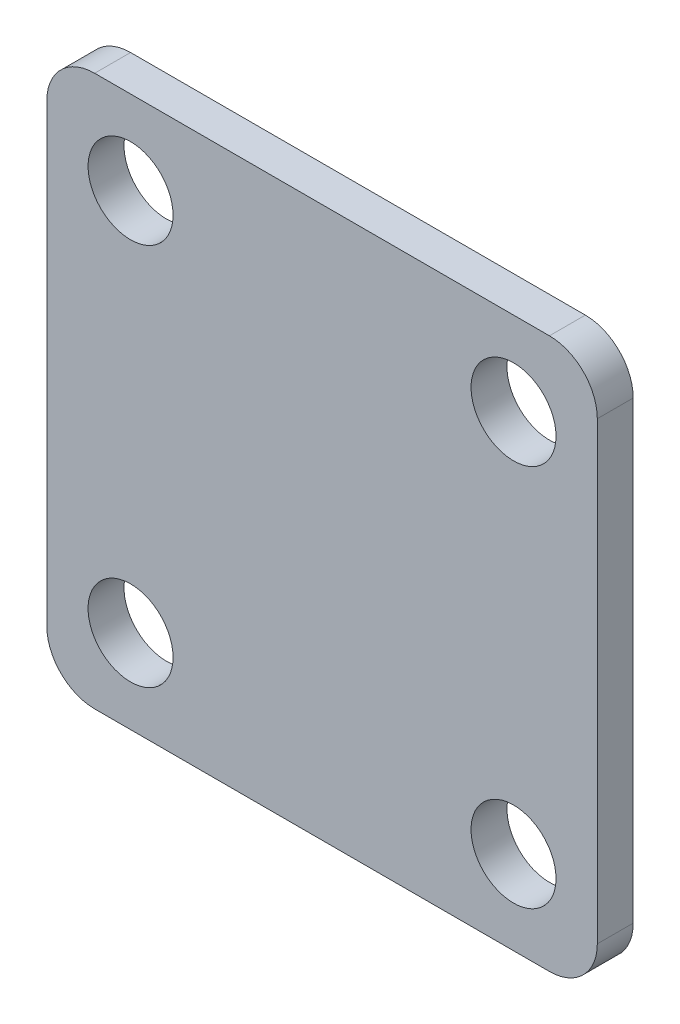
ISO-10303-21;
HEADER;
FILE_DESCRIPTION(('STEP AP214'),'2;1');
FILE_NAME('part.step','',(''),(''),'','','');
FILE_SCHEMA(('AUTOMOTIVE_DESIGN { 1 0 10303 214 1 1 1 1 }'));
ENDSEC;
DATA;
#1=APPLICATION_CONTEXT('core data for automotive mechanical design processes');
#2=APPLICATION_PROTOCOL_DEFINITION('international standard','automotive_design',2000,#1);
#3=PRODUCT_CONTEXT('',#1,'mechanical');
#4=PRODUCT('Part','Part','',(#3));
#5=PRODUCT_RELATED_PRODUCT_CATEGORY('part','',(#4));
#6=PRODUCT_DEFINITION_FORMATION('','',#4);
#7=PRODUCT_DEFINITION_CONTEXT('part definition',#1,'design');
#8=PRODUCT_DEFINITION('design','',#6,#7);
#9=PRODUCT_DEFINITION_SHAPE('','',#8);
#10=(LENGTH_UNIT() NAMED_UNIT(*) SI_UNIT(.MILLI.,.METRE.));
#11=(NAMED_UNIT(*) PLANE_ANGLE_UNIT() SI_UNIT($,.RADIAN.));
#12=(NAMED_UNIT(*) SI_UNIT($,.STERADIAN.) SOLID_ANGLE_UNIT());
#13=UNCERTAINTY_MEASURE_WITH_UNIT(LENGTH_MEASURE(1.E-05),#10,'distance_accuracy_value','');
#14=(GEOMETRIC_REPRESENTATION_CONTEXT(3) GLOBAL_UNCERTAINTY_ASSIGNED_CONTEXT((#13)) GLOBAL_UNIT_ASSIGNED_CONTEXT((#10,
#11,#12)) REPRESENTATION_CONTEXT('',''));
#15=CARTESIAN_POINT('',(0.,0.,0.));
#16=DIRECTION('',(0.,0.,1.));
#17=DIRECTION('',(1.,0.,0.));
#18=AXIS2_PLACEMENT_3D('',#15,#16,#17);
#19=CARTESIAN_POINT('',(-9.5,-9.5,1.5));
#20=DIRECTION('',(0.,0.,1.));
#21=DIRECTION('',(1.,0.,0.));
#22=AXIS2_PLACEMENT_3D('',#19,#20,#21);
#23=PLANE('',#22);
#24=CARTESIAN_POINT('',(8.00000040045571,-8.00000040045571,1.5));
#25=DIRECTION('',(0.,0.,1.));
#26=DIRECTION('',(1.,0.,0.));
#27=AXIS2_PLACEMENT_3D('',#24,#25,#26);
#28=CIRCLE('',#27,1.775);
#29=CARTESIAN_POINT('',(9.77500040045571,-8.00000040045571,1.5));
#30=VERTEX_POINT('',#29);
#31=EDGE_CURVE('E227',#30,#30,#28,.T.);
#32=ORIENTED_EDGE('',*,*,#31,.F.);
#33=EDGE_LOOP('',(#32));
#34=FACE_BOUND('',#33,.T.);
#35=CARTESIAN_POINT('',(-8.00000040045571,8.00000040045571,1.5));
#36=DIRECTION('',(0.,0.,1.));
#37=DIRECTION('',(1.,0.,0.));
#38=AXIS2_PLACEMENT_3D('',#35,#36,#37);
#39=CIRCLE('',#38,1.775);
#40=CARTESIAN_POINT('',(-6.22500040045571,8.00000040045571,1.5));
#41=VERTEX_POINT('',#40);
#42=EDGE_CURVE('E152',#41,#41,#39,.T.);
#43=ORIENTED_EDGE('',*,*,#42,.F.);
#44=EDGE_LOOP('',(#43));
#45=FACE_BOUND('',#44,.T.);
#46=CARTESIAN_POINT('',(-9.5,-9.5,1.5));
#47=DIRECTION('',(0.,0.,1.));
#48=DIRECTION('',(1.,0.,0.));
#49=AXIS2_PLACEMENT_3D('',#46,#47,#48);
#50=CIRCLE('',#49,2.);
#51=CARTESIAN_POINT('',(-11.5,-9.49999999999999,1.5));
#52=VERTEX_POINT('',#51);
#53=CARTESIAN_POINT('',(-9.49999999999999,-11.5,1.5));
#54=VERTEX_POINT('',#53);
#55=EDGE_CURVE('E170',#52,#54,#50,.T.);
#56=ORIENTED_EDGE('',*,*,#55,.T.);
#57=DIRECTION('',(1.,0.,0.));
#58=VECTOR('',#57,1.);
#59=CARTESIAN_POINT('',(-9.49999999999999,-11.5,1.5));
#60=LINE('',#59,#58);
#61=CARTESIAN_POINT('',(9.49999999999999,-11.5,1.5));
#62=VERTEX_POINT('',#61);
#63=EDGE_CURVE('E106',#54,#62,#60,.T.);
#64=ORIENTED_EDGE('',*,*,#63,.T.);
#65=CARTESIAN_POINT('',(9.5,-9.5,1.5));
#66=DIRECTION('',(0.,0.,1.));
#67=DIRECTION('',(1.,0.,0.));
#68=AXIS2_PLACEMENT_3D('',#65,#66,#67);
#69=CIRCLE('',#68,2.);
#70=CARTESIAN_POINT('',(11.5,-9.49999999999999,1.5));
#71=VERTEX_POINT('',#70);
#72=EDGE_CURVE('E191',#62,#71,#69,.T.);
#73=ORIENTED_EDGE('',*,*,#72,.T.);
#74=DIRECTION('',(0.,1.,0.));
#75=VECTOR('',#74,1.);
#76=CARTESIAN_POINT('',(11.5,9.49999999999998,1.5));
#77=LINE('',#76,#75);
#78=CARTESIAN_POINT('',(11.5,9.49999999999998,1.5));
#79=VERTEX_POINT('',#78);
#80=EDGE_CURVE('E205',#71,#79,#77,.T.);
#81=ORIENTED_EDGE('',*,*,#80,.T.);
#82=CARTESIAN_POINT('',(9.5,9.5,1.5));
#83=DIRECTION('',(0.,0.,1.));
#84=DIRECTION('',(-1.,0.,0.));
#85=AXIS2_PLACEMENT_3D('',#82,#83,#84);
#86=CIRCLE('',#85,2.);
#87=CARTESIAN_POINT('',(9.49999999999998,11.5,1.5));
#88=VERTEX_POINT('',#87);
#89=EDGE_CURVE('E125',#79,#88,#86,.T.);
#90=ORIENTED_EDGE('',*,*,#89,.T.);
#91=DIRECTION('',(-1.,0.,0.));
#92=VECTOR('',#91,1.);
#93=CARTESIAN_POINT('',(-9.49999999999999,11.5,1.5));
#94=LINE('',#93,#92);
#95=CARTESIAN_POINT('',(-9.49999999999999,11.5,1.5));
#96=VERTEX_POINT('',#95);
#97=EDGE_CURVE('E119',#88,#96,#94,.T.);
#98=ORIENTED_EDGE('',*,*,#97,.T.);
#99=CARTESIAN_POINT('',(-9.5,9.5,1.5));
#100=DIRECTION('',(0.,0.,1.));
#101=DIRECTION('',(1.,0.,0.));
#102=AXIS2_PLACEMENT_3D('',#99,#100,#101);
#103=CIRCLE('',#102,2.);
#104=CARTESIAN_POINT('',(-11.5,9.49999999999998,1.5));
#105=VERTEX_POINT('',#104);
#106=EDGE_CURVE('E123',#96,#105,#103,.T.);
#107=ORIENTED_EDGE('',*,*,#106,.T.);
#108=DIRECTION('',(0.,-1.,0.));
#109=VECTOR('',#108,1.);
#110=CARTESIAN_POINT('',(-11.5,9.49999999999998,1.5));
#111=LINE('',#110,#109);
#112=EDGE_CURVE('E63',#105,#52,#111,.T.);
#113=ORIENTED_EDGE('',*,*,#112,.T.);
#114=EDGE_LOOP('',(#56,#64,#73,#81,#90,#98,#107,#113));
#115=FACE_BOUND('',#114,.T.);
#116=CARTESIAN_POINT('',(7.99999959954429,7.99999959954429,1.5));
#117=DIRECTION('',(0.,0.,1.));
#118=DIRECTION('',(1.,0.,0.));
#119=AXIS2_PLACEMENT_3D('',#116,#117,#118);
#120=CIRCLE('',#119,1.775);
#121=CARTESIAN_POINT('',(9.77499959954429,7.99999959954429,1.5));
#122=VERTEX_POINT('',#121);
#123=EDGE_CURVE('E219',#122,#122,#120,.T.);
#124=ORIENTED_EDGE('',*,*,#123,.F.);
#125=EDGE_LOOP('',(#124));
#126=FACE_BOUND('',#125,.T.);
#127=CARTESIAN_POINT('',(-7.99999959954429,-7.99999959954429,1.5));
#128=DIRECTION('',(0.,0.,1.));
#129=DIRECTION('',(1.,0.,0.));
#130=AXIS2_PLACEMENT_3D('',#127,#128,#129);
#131=CIRCLE('',#130,1.775);
#132=CARTESIAN_POINT('',(-6.22499959954429,-7.99999959954429,1.5));
#133=VERTEX_POINT('',#132);
#134=EDGE_CURVE('E235',#133,#133,#131,.T.);
#135=ORIENTED_EDGE('',*,*,#134,.F.);
#136=EDGE_LOOP('',(#135));
#137=FACE_BOUND('',#136,.T.);
#138=ADVANCED_FACE('F45',(#34,#45,#115,#126,#137),#23,.T.);
#139=CARTESIAN_POINT('',(-9.5,-9.5,0.));
#140=DIRECTION('',(0.,0.,1.));
#141=DIRECTION('',(1.,0.,0.));
#142=AXIS2_PLACEMENT_3D('',#139,#140,#141);
#143=PLANE('',#142);
#144=CARTESIAN_POINT('',(-9.5,-9.5,0.));
#145=DIRECTION('',(0.,0.,1.));
#146=DIRECTION('',(1.,0.,0.));
#147=AXIS2_PLACEMENT_3D('',#144,#145,#146);
#148=CIRCLE('',#147,2.);
#149=CARTESIAN_POINT('',(-11.5,-9.49999999999999,0.));
#150=VERTEX_POINT('',#149);
#151=CARTESIAN_POINT('',(-9.49999999999999,-11.5,0.));
#152=VERTEX_POINT('',#151);
#153=EDGE_CURVE('E147',#150,#152,#148,.T.);
#154=ORIENTED_EDGE('',*,*,#153,.F.);
#155=DIRECTION('',(0.,-1.,0.));
#156=VECTOR('',#155,1.);
#157=CARTESIAN_POINT('',(-11.5,9.49999999999998,0.));
#158=LINE('',#157,#156);
#159=CARTESIAN_POINT('',(-11.5,9.49999999999998,0.));
#160=VERTEX_POINT('',#159);
#161=EDGE_CURVE('E98',#160,#150,#158,.T.);
#162=ORIENTED_EDGE('',*,*,#161,.F.);
#163=CARTESIAN_POINT('',(-9.5,9.5,0.));
#164=DIRECTION('',(0.,0.,1.));
#165=DIRECTION('',(1.,0.,0.));
#166=AXIS2_PLACEMENT_3D('',#163,#164,#165);
#167=CIRCLE('',#166,2.);
#168=CARTESIAN_POINT('',(-9.49999999999999,11.5,0.));
#169=VERTEX_POINT('',#168);
#170=EDGE_CURVE('E92',#169,#160,#167,.T.);
#171=ORIENTED_EDGE('',*,*,#170,.F.);
#172=DIRECTION('',(-1.,0.,0.));
#173=VECTOR('',#172,1.);
#174=CARTESIAN_POINT('',(-9.49999999999999,11.5,0.));
#175=LINE('',#174,#173);
#176=CARTESIAN_POINT('',(9.49999999999998,11.5,0.));
#177=VERTEX_POINT('',#176);
#178=EDGE_CURVE('E134',#177,#169,#175,.T.);
#179=ORIENTED_EDGE('',*,*,#178,.F.);
#180=CARTESIAN_POINT('',(9.5,9.5,0.));
#181=DIRECTION('',(0.,0.,1.));
#182=DIRECTION('',(-1.,0.,0.));
#183=AXIS2_PLACEMENT_3D('',#180,#181,#182);
#184=CIRCLE('',#183,2.);
#185=CARTESIAN_POINT('',(11.5,9.49999999999998,0.));
#186=VERTEX_POINT('',#185);
#187=EDGE_CURVE('E161',#186,#177,#184,.T.);
#188=ORIENTED_EDGE('',*,*,#187,.F.);
#189=DIRECTION('',(0.,1.,0.));
#190=VECTOR('',#189,1.);
#191=CARTESIAN_POINT('',(11.5,9.49999999999998,0.));
#192=LINE('',#191,#190);
#193=CARTESIAN_POINT('',(11.5,-9.49999999999999,0.));
#194=VERTEX_POINT('',#193);
#195=EDGE_CURVE('E158',#194,#186,#192,.T.);
#196=ORIENTED_EDGE('',*,*,#195,.F.);
#197=CARTESIAN_POINT('',(9.5,-9.5,0.));
#198=DIRECTION('',(0.,0.,1.));
#199=DIRECTION('',(1.,0.,0.));
#200=AXIS2_PLACEMENT_3D('',#197,#198,#199);
#201=CIRCLE('',#200,2.);
#202=CARTESIAN_POINT('',(9.49999999999999,-11.5,0.));
#203=VERTEX_POINT('',#202);
#204=EDGE_CURVE('E155',#203,#194,#201,.T.);
#205=ORIENTED_EDGE('',*,*,#204,.F.);
#206=DIRECTION('',(1.,0.,0.));
#207=VECTOR('',#206,1.);
#208=CARTESIAN_POINT('',(-9.49999999999999,-11.5,0.));
#209=LINE('',#208,#207);
#210=EDGE_CURVE('E151',#152,#203,#209,.T.);
#211=ORIENTED_EDGE('',*,*,#210,.F.);
#212=EDGE_LOOP('',(#154,#162,#171,#179,#188,#196,#205,#211));
#213=FACE_BOUND('',#212,.T.);
#214=CARTESIAN_POINT('',(-8.00000040045571,8.00000040045571,0.));
#215=DIRECTION('',(0.,0.,1.));
#216=DIRECTION('',(1.,0.,0.));
#217=AXIS2_PLACEMENT_3D('',#214,#215,#216);
#218=CIRCLE('',#217,1.775);
#219=CARTESIAN_POINT('',(-6.22500040045571,8.00000040045571,0.));
#220=VERTEX_POINT('',#219);
#221=EDGE_CURVE('E215',#220,#220,#218,.T.);
#222=ORIENTED_EDGE('',*,*,#221,.T.);
#223=EDGE_LOOP('',(#222));
#224=FACE_BOUND('',#223,.T.);
#225=CARTESIAN_POINT('',(7.99999959954429,7.99999959954429,0.));
#226=DIRECTION('',(0.,0.,1.));
#227=DIRECTION('',(1.,0.,0.));
#228=AXIS2_PLACEMENT_3D('',#225,#226,#227);
#229=CIRCLE('',#228,1.775);
#230=CARTESIAN_POINT('',(9.77499959954429,7.99999959954429,0.));
#231=VERTEX_POINT('',#230);
#232=EDGE_CURVE('E223',#231,#231,#229,.T.);
#233=ORIENTED_EDGE('',*,*,#232,.T.);
#234=EDGE_LOOP('',(#233));
#235=FACE_BOUND('',#234,.T.);
#236=CARTESIAN_POINT('',(8.00000040045571,-8.00000040045571,0.));
#237=DIRECTION('',(0.,0.,1.));
#238=DIRECTION('',(1.,0.,0.));
#239=AXIS2_PLACEMENT_3D('',#236,#237,#238);
#240=CIRCLE('',#239,1.775);
#241=CARTESIAN_POINT('',(9.77500040045571,-8.00000040045571,0.));
#242=VERTEX_POINT('',#241);
#243=EDGE_CURVE('E231',#242,#242,#240,.T.);
#244=ORIENTED_EDGE('',*,*,#243,.T.);
#245=EDGE_LOOP('',(#244));
#246=FACE_BOUND('',#245,.T.);
#247=CARTESIAN_POINT('',(-7.99999959954429,-7.99999959954429,0.));
#248=DIRECTION('',(0.,0.,1.));
#249=DIRECTION('',(1.,0.,0.));
#250=AXIS2_PLACEMENT_3D('',#247,#248,#249);
#251=CIRCLE('',#250,1.775);
#252=CARTESIAN_POINT('',(-6.22499959954429,-7.99999959954429,0.));
#253=VERTEX_POINT('',#252);
#254=EDGE_CURVE('E239',#253,#253,#251,.T.);
#255=ORIENTED_EDGE('',*,*,#254,.T.);
#256=EDGE_LOOP('',(#255));
#257=FACE_BOUND('',#256,.T.);
#258=ADVANCED_FACE('F195',(#213,#224,#235,#246,#257),#143,.F.);
#259=CARTESIAN_POINT('',(-9.5,-9.5,1.5));
#260=DIRECTION('',(0.,0.,-1.));
#261=DIRECTION('',(-1.,0.,0.));
#262=AXIS2_PLACEMENT_3D('',#259,#260,#261);
#263=CYLINDRICAL_SURFACE('',#262,2.);
#264=ORIENTED_EDGE('',*,*,#153,.T.);
#265=DIRECTION('',(0.,0.,-1.));
#266=VECTOR('',#265,1.);
#267=CARTESIAN_POINT('',(-9.49999999999999,-11.5,1.5));
#268=LINE('',#267,#266);
#269=EDGE_CURVE('E11',#54,#152,#268,.T.);
#270=ORIENTED_EDGE('',*,*,#269,.F.);
#271=ORIENTED_EDGE('',*,*,#55,.F.);
#272=DIRECTION('',(0.,0.,-1.));
#273=VECTOR('',#272,1.);
#274=CARTESIAN_POINT('',(-11.5,-9.49999999999999,1.5));
#275=LINE('',#274,#273);
#276=EDGE_CURVE('E143',#52,#150,#275,.T.);
#277=ORIENTED_EDGE('',*,*,#276,.T.);
#278=EDGE_LOOP('',(#264,#270,#271,#277));
#279=FACE_BOUND('',#278,.T.);
#280=ADVANCED_FACE('F47',(#279),#263,.T.);
#281=CARTESIAN_POINT('',(-9.49999999999999,-11.5,1.5));
#282=DIRECTION('',(0.,1.,0.));
#283=DIRECTION('',(0.,0.,1.));
#284=AXIS2_PLACEMENT_3D('',#281,#282,#283);
#285=PLANE('',#284);
#286=ORIENTED_EDGE('',*,*,#210,.T.);
#287=DIRECTION('',(0.,0.,-1.));
#288=VECTOR('',#287,1.);
#289=CARTESIAN_POINT('',(9.49999999999999,-11.5,1.5));
#290=LINE('',#289,#288);
#291=EDGE_CURVE('E55',#62,#203,#290,.T.);
#292=ORIENTED_EDGE('',*,*,#291,.F.);
#293=ORIENTED_EDGE('',*,*,#63,.F.);
#294=ORIENTED_EDGE('',*,*,#269,.T.);
#295=EDGE_LOOP('',(#286,#292,#293,#294));
#296=FACE_BOUND('',#295,.T.);
#297=ADVANCED_FACE('F275',(#296),#285,.F.);
#298=CARTESIAN_POINT('',(9.5,-9.5,1.5));
#299=DIRECTION('',(0.,0.,-1.));
#300=DIRECTION('',(-1.,0.,0.));
#301=AXIS2_PLACEMENT_3D('',#298,#299,#300);
#302=CYLINDRICAL_SURFACE('',#301,2.);
#303=ORIENTED_EDGE('',*,*,#204,.T.);
#304=DIRECTION('',(0.,0.,-1.));
#305=VECTOR('',#304,1.);
#306=CARTESIAN_POINT('',(11.5,-9.49999999999999,1.5));
#307=LINE('',#306,#305);
#308=EDGE_CURVE('E181',#71,#194,#307,.T.);
#309=ORIENTED_EDGE('',*,*,#308,.F.);
#310=ORIENTED_EDGE('',*,*,#72,.F.);
#311=ORIENTED_EDGE('',*,*,#291,.T.);
#312=EDGE_LOOP('',(#303,#309,#310,#311));
#313=FACE_BOUND('',#312,.T.);
#314=ADVANCED_FACE('F189',(#313),#302,.T.);
#315=CARTESIAN_POINT('',(11.5,9.49999999999998,1.5));
#316=DIRECTION('',(-1.,0.,0.));
#317=DIRECTION('',(0.,-1.,0.));
#318=AXIS2_PLACEMENT_3D('',#315,#316,#317);
#319=PLANE('',#318);
#320=ORIENTED_EDGE('',*,*,#195,.T.);
#321=DIRECTION('',(0.,0.,-1.));
#322=VECTOR('',#321,1.);
#323=CARTESIAN_POINT('',(11.5,9.49999999999998,1.5));
#324=LINE('',#323,#322);
#325=EDGE_CURVE('E177',#79,#186,#324,.T.);
#326=ORIENTED_EDGE('',*,*,#325,.F.);
#327=ORIENTED_EDGE('',*,*,#80,.F.);
#328=ORIENTED_EDGE('',*,*,#308,.T.);
#329=EDGE_LOOP('',(#320,#326,#327,#328));
#330=FACE_BOUND('',#329,.T.);
#331=ADVANCED_FACE('F200',(#330),#319,.F.);
#332=CARTESIAN_POINT('',(9.5,9.5,1.5));
#333=DIRECTION('',(0.,0.,-1.));
#334=DIRECTION('',(-1.,0.,0.));
#335=AXIS2_PLACEMENT_3D('',#332,#333,#334);
#336=CYLINDRICAL_SURFACE('',#335,2.);
#337=ORIENTED_EDGE('',*,*,#187,.T.);
#338=DIRECTION('',(0.,0.,-1.));
#339=VECTOR('',#338,1.);
#340=CARTESIAN_POINT('',(9.49999999999998,11.5,1.5));
#341=LINE('',#340,#339);
#342=EDGE_CURVE('E136',#88,#177,#341,.T.);
#343=ORIENTED_EDGE('',*,*,#342,.F.);
#344=ORIENTED_EDGE('',*,*,#89,.F.);
#345=ORIENTED_EDGE('',*,*,#325,.T.);
#346=EDGE_LOOP('',(#337,#343,#344,#345));
#347=FACE_BOUND('',#346,.T.);
#348=ADVANCED_FACE('F203',(#347),#336,.T.);
#349=CARTESIAN_POINT('',(-9.49999999999999,11.5,1.5));
#350=DIRECTION('',(0.,-1.,0.));
#351=DIRECTION('',(0.,0.,-1.));
#352=AXIS2_PLACEMENT_3D('',#349,#350,#351);
#353=PLANE('',#352);
#354=ORIENTED_EDGE('',*,*,#178,.T.);
#355=DIRECTION('',(0.,0.,-1.));
#356=VECTOR('',#355,1.);
#357=CARTESIAN_POINT('',(-9.49999999999999,11.5,1.5));
#358=LINE('',#357,#356);
#359=EDGE_CURVE('E131',#96,#169,#358,.T.);
#360=ORIENTED_EDGE('',*,*,#359,.F.);
#361=ORIENTED_EDGE('',*,*,#97,.F.);
#362=ORIENTED_EDGE('',*,*,#342,.T.);
#363=EDGE_LOOP('',(#354,#360,#361,#362));
#364=FACE_BOUND('',#363,.T.);
#365=ADVANCED_FACE('F132',(#364),#353,.F.);
#366=CARTESIAN_POINT('',(-9.5,9.5,1.5));
#367=DIRECTION('',(0.,0.,-1.));
#368=DIRECTION('',(-1.,0.,0.));
#369=AXIS2_PLACEMENT_3D('',#366,#367,#368);
#370=CYLINDRICAL_SURFACE('',#369,2.);
#371=ORIENTED_EDGE('',*,*,#170,.T.);
#372=DIRECTION('',(0.,0.,-1.));
#373=VECTOR('',#372,1.);
#374=CARTESIAN_POINT('',(-11.5,9.49999999999998,1.5));
#375=LINE('',#374,#373);
#376=EDGE_CURVE('E137',#105,#160,#375,.T.);
#377=ORIENTED_EDGE('',*,*,#376,.F.);
#378=ORIENTED_EDGE('',*,*,#106,.F.);
#379=ORIENTED_EDGE('',*,*,#359,.T.);
#380=EDGE_LOOP('',(#371,#377,#378,#379));
#381=FACE_BOUND('',#380,.T.);
#382=ADVANCED_FACE('F139',(#381),#370,.T.);
#383=CARTESIAN_POINT('',(-11.5,9.49999999999998,1.5));
#384=DIRECTION('',(1.,0.,0.));
#385=DIRECTION('',(0.,1.,0.));
#386=AXIS2_PLACEMENT_3D('',#383,#384,#385);
#387=PLANE('',#386);
#388=ORIENTED_EDGE('',*,*,#161,.T.);
#389=ORIENTED_EDGE('',*,*,#276,.F.);
#390=ORIENTED_EDGE('',*,*,#112,.F.);
#391=ORIENTED_EDGE('',*,*,#376,.T.);
#392=EDGE_LOOP('',(#388,#389,#390,#391));
#393=FACE_BOUND('',#392,.T.);
#394=ADVANCED_FACE('F263',(#393),#387,.F.);
#395=CARTESIAN_POINT('',(-8.00000040045571,8.00000040045571,1.5));
#396=DIRECTION('',(0.,0.,-1.));
#397=DIRECTION('',(-1.,0.,0.));
#398=AXIS2_PLACEMENT_3D('',#395,#396,#397);
#399=CYLINDRICAL_SURFACE('',#398,1.775);
#400=ORIENTED_EDGE('',*,*,#42,.T.);
#401=EDGE_LOOP('',(#400));
#402=FACE_BOUND('',#401,.T.);
#403=ORIENTED_EDGE('',*,*,#221,.F.);
#404=EDGE_LOOP('',(#403));
#405=FACE_BOUND('',#404,.T.);
#406=ADVANCED_FACE('F260',(#402,#405),#399,.F.);
#407=CARTESIAN_POINT('',(7.99999959954429,7.99999959954429,1.5));
#408=DIRECTION('',(0.,0.,-1.));
#409=DIRECTION('',(-1.,0.,0.));
#410=AXIS2_PLACEMENT_3D('',#407,#408,#409);
#411=CYLINDRICAL_SURFACE('',#410,1.775);
#412=ORIENTED_EDGE('',*,*,#123,.T.);
#413=EDGE_LOOP('',(#412));
#414=FACE_BOUND('',#413,.T.);
#415=ORIENTED_EDGE('',*,*,#232,.F.);
#416=EDGE_LOOP('',(#415));
#417=FACE_BOUND('',#416,.T.);
#418=ADVANCED_FACE('F338',(#414,#417),#411,.F.);
#419=CARTESIAN_POINT('',(8.00000040045571,-8.00000040045571,1.5));
#420=DIRECTION('',(0.,0.,-1.));
#421=DIRECTION('',(-1.,0.,0.));
#422=AXIS2_PLACEMENT_3D('',#419,#420,#421);
#423=CYLINDRICAL_SURFACE('',#422,1.775);
#424=ORIENTED_EDGE('',*,*,#31,.T.);
#425=EDGE_LOOP('',(#424));
#426=FACE_BOUND('',#425,.T.);
#427=ORIENTED_EDGE('',*,*,#243,.F.);
#428=EDGE_LOOP('',(#427));
#429=FACE_BOUND('',#428,.T.);
#430=ADVANCED_FACE('F346',(#426,#429),#423,.F.);
#431=CARTESIAN_POINT('',(-7.99999959954429,-7.99999959954429,1.5));
#432=DIRECTION('',(0.,0.,-1.));
#433=DIRECTION('',(-1.,0.,0.));
#434=AXIS2_PLACEMENT_3D('',#431,#432,#433);
#435=CYLINDRICAL_SURFACE('',#434,1.775);
#436=ORIENTED_EDGE('',*,*,#134,.T.);
#437=EDGE_LOOP('',(#436));
#438=FACE_BOUND('',#437,.T.);
#439=ORIENTED_EDGE('',*,*,#254,.F.);
#440=EDGE_LOOP('',(#439));
#441=FACE_BOUND('',#440,.T.);
#442=ADVANCED_FACE('F247',(#438,#441),#435,.F.);
#443=CLOSED_SHELL('',(#138,#258,#280,#297,#314,#331,#348,#365,#382,#394,#406,#418,#430,#442));
#444=MANIFOLD_SOLID_BREP('B2',#443);
#445=ADVANCED_BREP_SHAPE_REPRESENTATION('',(#18,#444),#14);
#446=SHAPE_DEFINITION_REPRESENTATION(#9,#445);
ENDSEC;
END-ISO-10303-21;
